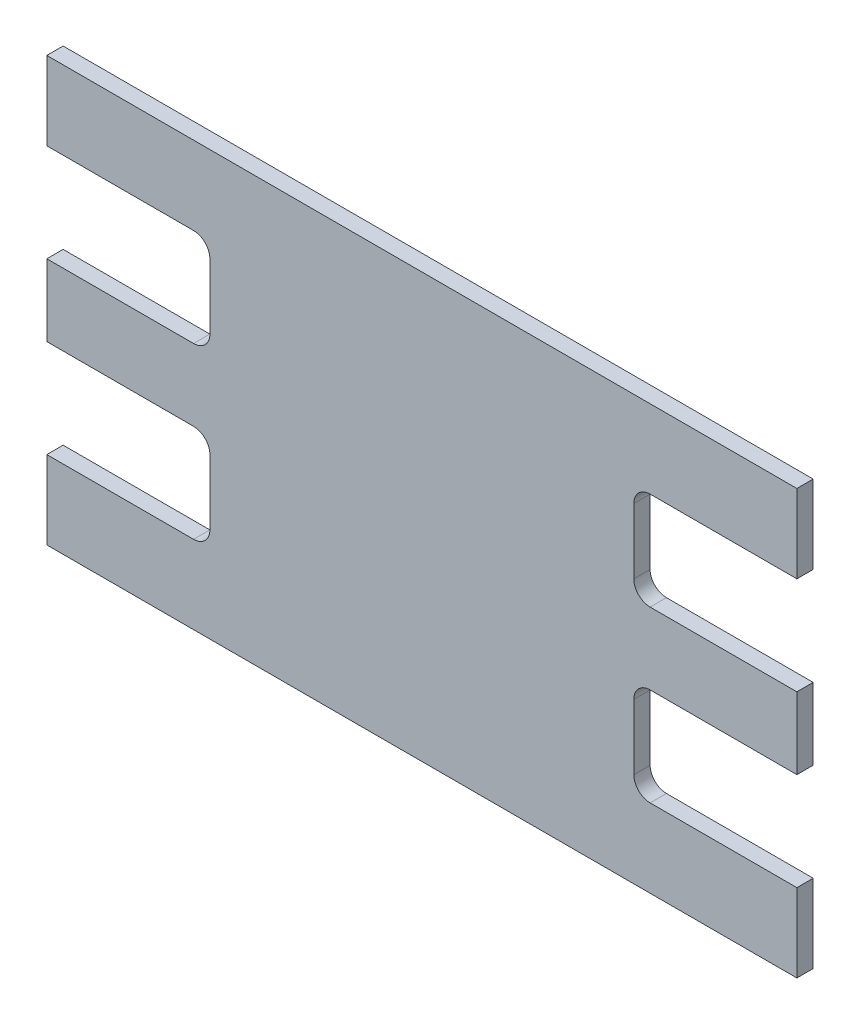
ISO-10303-21;
HEADER;
FILE_DESCRIPTION(('STEP AP214'),'2;1');
FILE_NAME('part.step','',(''),(''),'','','');
FILE_SCHEMA(('AUTOMOTIVE_DESIGN { 1 0 10303 214 1 1 1 1 }'));
ENDSEC;
DATA;
#1=APPLICATION_CONTEXT('core data for automotive mechanical design processes');
#2=APPLICATION_PROTOCOL_DEFINITION('international standard','automotive_design',2000,#1);
#3=PRODUCT_CONTEXT('',#1,'mechanical');
#4=PRODUCT('Part','Part','',(#3));
#5=PRODUCT_RELATED_PRODUCT_CATEGORY('part','',(#4));
#6=PRODUCT_DEFINITION_FORMATION('','',#4);
#7=PRODUCT_DEFINITION_CONTEXT('part definition',#1,'design');
#8=PRODUCT_DEFINITION('design','',#6,#7);
#9=PRODUCT_DEFINITION_SHAPE('','',#8);
#10=(LENGTH_UNIT() NAMED_UNIT(*) SI_UNIT(.MILLI.,.METRE.));
#11=(NAMED_UNIT(*) PLANE_ANGLE_UNIT() SI_UNIT($,.RADIAN.));
#12=(NAMED_UNIT(*) SI_UNIT($,.STERADIAN.) SOLID_ANGLE_UNIT());
#13=UNCERTAINTY_MEASURE_WITH_UNIT(LENGTH_MEASURE(1.E-05),#10,'distance_accuracy_value','');
#14=(GEOMETRIC_REPRESENTATION_CONTEXT(3) GLOBAL_UNCERTAINTY_ASSIGNED_CONTEXT((#13)) GLOBAL_UNIT_ASSIGNED_CONTEXT((#10,
#11,#12)) REPRESENTATION_CONTEXT('',''));
#15=CARTESIAN_POINT('',(0.,0.,0.));
#16=DIRECTION('',(0.,0.,1.));
#17=DIRECTION('',(1.,0.,0.));
#18=AXIS2_PLACEMENT_3D('',#15,#16,#17);
#19=CARTESIAN_POINT('',(146.05,82.55,6.35));
#20=DIRECTION('',(-1.,0.,0.));
#21=DIRECTION('',(0.,-1.,0.));
#22=AXIS2_PLACEMENT_3D('',#19,#20,#21);
#23=PLANE('',#22);
#24=DIRECTION('',(0.,1.,0.));
#25=VECTOR('',#24,1.);
#26=CARTESIAN_POINT('',(146.05,82.55,6.35));
#27=LINE('',#26,#25);
#28=CARTESIAN_POINT('',(146.05,52.0700000000001,6.35));
#29=VERTEX_POINT('',#28);
#30=CARTESIAN_POINT('',(146.05,82.55,6.35));
#31=VERTEX_POINT('',#30);
#32=EDGE_CURVE('E397',#29,#31,#27,.T.);
#33=ORIENTED_EDGE('',*,*,#32,.F.);
#34=DIRECTION('',(0.,0.,1.));
#35=VECTOR('',#34,1.);
#36=CARTESIAN_POINT('',(146.05,52.0700000000001,0.));
#37=LINE('',#36,#35);
#38=CARTESIAN_POINT('',(146.05,52.0700000000001,0.));
#39=VERTEX_POINT('',#38);
#40=EDGE_CURVE('E260',#39,#29,#37,.T.);
#41=ORIENTED_EDGE('',*,*,#40,.F.);
#42=DIRECTION('',(0.,1.,0.));
#43=VECTOR('',#42,1.);
#44=CARTESIAN_POINT('',(146.05,82.55,0.));
#45=LINE('',#44,#43);
#46=CARTESIAN_POINT('',(146.05,82.55,0.));
#47=VERTEX_POINT('',#46);
#48=EDGE_CURVE('E382',#39,#47,#45,.T.);
#49=ORIENTED_EDGE('',*,*,#48,.T.);
#50=DIRECTION('',(0.,0.,-1.));
#51=VECTOR('',#50,1.);
#52=CARTESIAN_POINT('',(146.05,82.55,6.35));
#53=LINE('',#52,#51);
#54=EDGE_CURVE('E11',#31,#47,#53,.T.);
#55=ORIENTED_EDGE('',*,*,#54,.F.);
#56=EDGE_LOOP('',(#33,#41,#49,#55));
#57=FACE_BOUND('',#56,.T.);
#58=ADVANCED_FACE('F33',(#57),#23,.F.);
#59=CARTESIAN_POINT('',(146.05,-13.9700000000001,0.));
#60=VERTEX_POINT('',#59);
#61=CARTESIAN_POINT('',(146.05,13.9700000000001,0.));
#62=VERTEX_POINT('',#61);
#63=EDGE_CURVE('E411',#60,#62,#45,.T.);
#64=ORIENTED_EDGE('',*,*,#63,.T.);
#65=DIRECTION('',(0.,0.,1.));
#66=VECTOR('',#65,1.);
#67=CARTESIAN_POINT('',(146.05,13.9700000000001,0.));
#68=LINE('',#67,#66);
#69=CARTESIAN_POINT('',(146.05,13.9700000000001,6.35));
#70=VERTEX_POINT('',#69);
#71=EDGE_CURVE('E262',#62,#70,#68,.T.);
#72=ORIENTED_EDGE('',*,*,#71,.T.);
#73=CARTESIAN_POINT('',(146.05,-13.9700000000001,6.35));
#74=VERTEX_POINT('',#73);
#75=EDGE_CURVE('E396',#74,#70,#27,.T.);
#76=ORIENTED_EDGE('',*,*,#75,.F.);
#77=DIRECTION('',(0.,0.,1.));
#78=VECTOR('',#77,1.);
#79=CARTESIAN_POINT('',(146.05,-13.9700000000001,0.));
#80=LINE('',#79,#78);
#81=EDGE_CURVE('E298',#60,#74,#80,.T.);
#82=ORIENTED_EDGE('',*,*,#81,.F.);
#83=EDGE_LOOP('',(#64,#72,#76,#82));
#84=FACE_BOUND('',#83,.T.);
#85=ADVANCED_FACE('F451',(#84),#23,.F.);
#86=CARTESIAN_POINT('',(-146.05,82.55,6.35));
#87=DIRECTION('',(1.,0.,0.));
#88=DIRECTION('',(0.,1.,0.));
#89=AXIS2_PLACEMENT_3D('',#86,#87,#88);
#90=PLANE('',#89);
#91=DIRECTION('',(0.,-1.,0.));
#92=VECTOR('',#91,1.);
#93=CARTESIAN_POINT('',(-146.05,82.55,6.35));
#94=LINE('',#93,#92);
#95=CARTESIAN_POINT('',(-146.05,-52.07,6.35));
#96=VERTEX_POINT('',#95);
#97=CARTESIAN_POINT('',(-146.05,-82.55,6.35));
#98=VERTEX_POINT('',#97);
#99=EDGE_CURVE('E399',#96,#98,#94,.T.);
#100=ORIENTED_EDGE('',*,*,#99,.F.);
#101=DIRECTION('',(0.,0.,1.));
#102=VECTOR('',#101,1.);
#103=CARTESIAN_POINT('',(-146.05,-52.07,0.));
#104=LINE('',#103,#102);
#105=CARTESIAN_POINT('',(-146.05,-52.07,0.));
#106=VERTEX_POINT('',#105);
#107=EDGE_CURVE('E340',#106,#96,#104,.T.);
#108=ORIENTED_EDGE('',*,*,#107,.F.);
#109=DIRECTION('',(0.,-1.,0.));
#110=VECTOR('',#109,1.);
#111=CARTESIAN_POINT('',(-146.05,82.55,0.));
#112=LINE('',#111,#110);
#113=CARTESIAN_POINT('',(-146.05,-82.55,0.));
#114=VERTEX_POINT('',#113);
#115=EDGE_CURVE('E413',#106,#114,#112,.T.);
#116=ORIENTED_EDGE('',*,*,#115,.T.);
#117=DIRECTION('',(0.,0.,-1.));
#118=VECTOR('',#117,1.);
#119=CARTESIAN_POINT('',(-146.05,-82.55,6.35));
#120=LINE('',#119,#118);
#121=EDGE_CURVE('E422',#98,#114,#120,.T.);
#122=ORIENTED_EDGE('',*,*,#121,.F.);
#123=EDGE_LOOP('',(#100,#108,#116,#122));
#124=FACE_BOUND('',#123,.T.);
#125=ADVANCED_FACE('F488',(#124),#90,.F.);
#126=CARTESIAN_POINT('',(-146.05,82.55,0.));
#127=VERTEX_POINT('',#126);
#128=CARTESIAN_POINT('',(-146.05,52.07,0.));
#129=VERTEX_POINT('',#128);
#130=EDGE_CURVE('E414',#127,#129,#112,.T.);
#131=ORIENTED_EDGE('',*,*,#130,.T.);
#132=DIRECTION('',(0.,0.,1.));
#133=VECTOR('',#132,1.);
#134=CARTESIAN_POINT('',(-146.05,52.07,0.));
#135=LINE('',#134,#133);
#136=CARTESIAN_POINT('',(-146.05,52.07,6.35));
#137=VERTEX_POINT('',#136);
#138=EDGE_CURVE('E379',#129,#137,#135,.T.);
#139=ORIENTED_EDGE('',*,*,#138,.T.);
#140=CARTESIAN_POINT('',(-146.05,82.55,6.35));
#141=VERTEX_POINT('',#140);
#142=EDGE_CURVE('E400',#141,#137,#94,.T.);
#143=ORIENTED_EDGE('',*,*,#142,.F.);
#144=DIRECTION('',(0.,0.,-1.));
#145=VECTOR('',#144,1.);
#146=CARTESIAN_POINT('',(-146.05,82.55,6.35));
#147=LINE('',#146,#145);
#148=EDGE_CURVE('E41',#141,#127,#147,.T.);
#149=ORIENTED_EDGE('',*,*,#148,.T.);
#150=EDGE_LOOP('',(#131,#139,#143,#149));
#151=FACE_BOUND('',#150,.T.);
#152=ADVANCED_FACE('F429',(#151),#90,.F.);
#153=CARTESIAN_POINT('',(146.05,-82.55,0.));
#154=VERTEX_POINT('',#153);
#155=CARTESIAN_POINT('',(146.05,-52.0700000000001,0.));
#156=VERTEX_POINT('',#155);
#157=EDGE_CURVE('E407',#154,#156,#45,.T.);
#158=ORIENTED_EDGE('',*,*,#157,.T.);
#159=DIRECTION('',(0.,0.,1.));
#160=VECTOR('',#159,1.);
#161=CARTESIAN_POINT('',(146.05,-52.0700000000001,0.));
#162=LINE('',#161,#160);
#163=CARTESIAN_POINT('',(146.05,-52.0700000000001,6.35));
#164=VERTEX_POINT('',#163);
#165=EDGE_CURVE('E300',#156,#164,#162,.T.);
#166=ORIENTED_EDGE('',*,*,#165,.T.);
#167=CARTESIAN_POINT('',(146.05,-82.55,6.35));
#168=VERTEX_POINT('',#167);
#169=EDGE_CURVE('E392',#168,#164,#27,.T.);
#170=ORIENTED_EDGE('',*,*,#169,.F.);
#171=DIRECTION('',(0.,0.,-1.));
#172=VECTOR('',#171,1.);
#173=CARTESIAN_POINT('',(146.05,-82.55,6.35));
#174=LINE('',#173,#172);
#175=EDGE_CURVE('E406',#168,#154,#174,.T.);
#176=ORIENTED_EDGE('',*,*,#175,.T.);
#177=EDGE_LOOP('',(#158,#166,#170,#176));
#178=FACE_BOUND('',#177,.T.);
#179=ADVANCED_FACE('F35',(#178),#23,.F.);
#180=CARTESIAN_POINT('',(-146.05,82.55,6.35));
#181=DIRECTION('',(0.,-1.,0.));
#182=DIRECTION('',(0.,0.,-1.));
#183=AXIS2_PLACEMENT_3D('',#180,#181,#182);
#184=PLANE('',#183);
#185=DIRECTION('',(-1.,0.,0.));
#186=VECTOR('',#185,1.);
#187=CARTESIAN_POINT('',(-146.05,82.55,0.));
#188=LINE('',#187,#186);
#189=EDGE_CURVE('E410',#47,#127,#188,.T.);
#190=ORIENTED_EDGE('',*,*,#189,.T.);
#191=ORIENTED_EDGE('',*,*,#148,.F.);
#192=DIRECTION('',(-1.,0.,0.));
#193=VECTOR('',#192,1.);
#194=CARTESIAN_POINT('',(-146.05,82.55,6.35));
#195=LINE('',#194,#193);
#196=EDGE_CURVE('E395',#31,#141,#195,.T.);
#197=ORIENTED_EDGE('',*,*,#196,.F.);
#198=ORIENTED_EDGE('',*,*,#54,.T.);
#199=EDGE_LOOP('',(#190,#191,#197,#198));
#200=FACE_BOUND('',#199,.T.);
#201=ADVANCED_FACE('F444',(#200),#184,.F.);
#202=CARTESIAN_POINT('',(-146.05,13.97,0.));
#203=VERTEX_POINT('',#202);
#204=CARTESIAN_POINT('',(-146.05,-13.97,0.));
#205=VERTEX_POINT('',#204);
#206=EDGE_CURVE('E418',#203,#205,#112,.T.);
#207=ORIENTED_EDGE('',*,*,#206,.T.);
#208=DIRECTION('',(0.,0.,1.));
#209=VECTOR('',#208,1.);
#210=CARTESIAN_POINT('',(-146.05,-13.97,0.));
#211=LINE('',#210,#209);
#212=CARTESIAN_POINT('',(-146.05,-13.97,6.35));
#213=VERTEX_POINT('',#212);
#214=EDGE_CURVE('E342',#205,#213,#211,.T.);
#215=ORIENTED_EDGE('',*,*,#214,.T.);
#216=CARTESIAN_POINT('',(-146.05,13.97,6.35));
#217=VERTEX_POINT('',#216);
#218=EDGE_CURVE('E404',#217,#213,#94,.T.);
#219=ORIENTED_EDGE('',*,*,#218,.F.);
#220=DIRECTION('',(0.,0.,1.));
#221=VECTOR('',#220,1.);
#222=CARTESIAN_POINT('',(-146.05,13.97,0.));
#223=LINE('',#222,#221);
#224=EDGE_CURVE('E366',#203,#217,#223,.T.);
#225=ORIENTED_EDGE('',*,*,#224,.F.);
#226=EDGE_LOOP('',(#207,#215,#219,#225));
#227=FACE_BOUND('',#226,.T.);
#228=ADVANCED_FACE('F494',(#227),#90,.F.);
#229=CARTESIAN_POINT('',(-146.05,-82.55,6.35));
#230=DIRECTION('',(0.,1.,0.));
#231=DIRECTION('',(0.,0.,1.));
#232=AXIS2_PLACEMENT_3D('',#229,#230,#231);
#233=PLANE('',#232);
#234=DIRECTION('',(1.,0.,0.));
#235=VECTOR('',#234,1.);
#236=CARTESIAN_POINT('',(-146.05,-82.55,0.));
#237=LINE('',#236,#235);
#238=EDGE_CURVE('E417',#114,#154,#237,.T.);
#239=ORIENTED_EDGE('',*,*,#238,.T.);
#240=ORIENTED_EDGE('',*,*,#175,.F.);
#241=DIRECTION('',(1.,0.,0.));
#242=VECTOR('',#241,1.);
#243=CARTESIAN_POINT('',(-146.05,-82.55,6.35));
#244=LINE('',#243,#242);
#245=EDGE_CURVE('E403',#98,#168,#244,.T.);
#246=ORIENTED_EDGE('',*,*,#245,.F.);
#247=ORIENTED_EDGE('',*,*,#121,.T.);
#248=EDGE_LOOP('',(#239,#240,#246,#247));
#249=FACE_BOUND('',#248,.T.);
#250=ADVANCED_FACE('F483',(#249),#233,.F.);
#251=CARTESIAN_POINT('',(146.05,-82.55,6.35));
#252=DIRECTION('',(0.,0.,1.));
#253=DIRECTION('',(1.,0.,0.));
#254=AXIS2_PLACEMENT_3D('',#251,#252,#253);
#255=PLANE('',#254);
#256=DIRECTION('',(-1.,0.,0.));
#257=VECTOR('',#256,1.);
#258=CARTESIAN_POINT('',(146.05,52.0700000000001,6.35));
#259=LINE('',#258,#257);
#260=CARTESIAN_POINT('',(88.9,52.07,6.35));
#261=VERTEX_POINT('',#260);
#262=EDGE_CURVE('E239',#29,#261,#259,.T.);
#263=ORIENTED_EDGE('',*,*,#262,.F.);
#264=ORIENTED_EDGE('',*,*,#32,.T.);
#265=ORIENTED_EDGE('',*,*,#196,.T.);
#266=ORIENTED_EDGE('',*,*,#142,.T.);
#267=DIRECTION('',(-1.,0.,0.));
#268=VECTOR('',#267,1.);
#269=CARTESIAN_POINT('',(-146.05,52.07,6.35));
#270=LINE('',#269,#268);
#271=CARTESIAN_POINT('',(-88.9,52.07,6.35));
#272=VERTEX_POINT('',#271);
#273=EDGE_CURVE('E354',#272,#137,#270,.T.);
#274=ORIENTED_EDGE('',*,*,#273,.F.);
#275=CARTESIAN_POINT('',(-88.9,45.72,6.35));
#276=DIRECTION('',(0.,0.,1.));
#277=DIRECTION('',(1.,0.,0.));
#278=AXIS2_PLACEMENT_3D('',#275,#276,#277);
#279=CIRCLE('',#278,6.35);
#280=CARTESIAN_POINT('',(-82.55,45.72,6.35));
#281=VERTEX_POINT('',#280);
#282=EDGE_CURVE('E375',#281,#272,#279,.T.);
#283=ORIENTED_EDGE('',*,*,#282,.F.);
#284=DIRECTION('',(0.,1.,0.));
#285=VECTOR('',#284,1.);
#286=CARTESIAN_POINT('',(-82.55,45.72,6.35));
#287=LINE('',#286,#285);
#288=CARTESIAN_POINT('',(-82.55,20.32,6.35));
#289=VERTEX_POINT('',#288);
#290=EDGE_CURVE('E372',#289,#281,#287,.T.);
#291=ORIENTED_EDGE('',*,*,#290,.F.);
#292=CARTESIAN_POINT('',(-88.9,20.32,6.35));
#293=DIRECTION('',(0.,0.,1.));
#294=DIRECTION('',(1.,0.,0.));
#295=AXIS2_PLACEMENT_3D('',#292,#293,#294);
#296=CIRCLE('',#295,6.35);
#297=CARTESIAN_POINT('',(-88.9,13.97,6.35));
#298=VERTEX_POINT('',#297);
#299=EDGE_CURVE('E369',#298,#289,#296,.T.);
#300=ORIENTED_EDGE('',*,*,#299,.F.);
#301=DIRECTION('',(1.,0.,0.));
#302=VECTOR('',#301,1.);
#303=CARTESIAN_POINT('',(-88.9,13.97,6.35));
#304=LINE('',#303,#302);
#305=EDGE_CURVE('E339',#217,#298,#304,.T.);
#306=ORIENTED_EDGE('',*,*,#305,.F.);
#307=ORIENTED_EDGE('',*,*,#218,.T.);
#308=DIRECTION('',(-1.,0.,0.));
#309=VECTOR('',#308,1.);
#310=CARTESIAN_POINT('',(-88.9,-13.97,6.35));
#311=LINE('',#310,#309);
#312=CARTESIAN_POINT('',(-88.9,-13.97,6.35));
#313=VERTEX_POINT('',#312);
#314=EDGE_CURVE('E333',#313,#213,#311,.T.);
#315=ORIENTED_EDGE('',*,*,#314,.F.);
#316=CARTESIAN_POINT('',(-88.9,-20.32,6.35));
#317=DIRECTION('',(0.,0.,1.));
#318=DIRECTION('',(-1.,0.,0.));
#319=AXIS2_PLACEMENT_3D('',#316,#317,#318);
#320=CIRCLE('',#319,6.35);
#321=CARTESIAN_POINT('',(-82.55,-20.32,6.35));
#322=VERTEX_POINT('',#321);
#323=EDGE_CURVE('E330',#322,#313,#320,.T.);
#324=ORIENTED_EDGE('',*,*,#323,.F.);
#325=DIRECTION('',(0.,1.,0.));
#326=VECTOR('',#325,1.);
#327=CARTESIAN_POINT('',(-82.55,-45.72,6.35));
#328=LINE('',#327,#326);
#329=CARTESIAN_POINT('',(-82.55,-45.72,6.35));
#330=VERTEX_POINT('',#329);
#331=EDGE_CURVE('E327',#330,#322,#328,.T.);
#332=ORIENTED_EDGE('',*,*,#331,.F.);
#333=CARTESIAN_POINT('',(-88.9,-45.72,6.35));
#334=DIRECTION('',(0.,0.,1.));
#335=DIRECTION('',(-1.,0.,0.));
#336=AXIS2_PLACEMENT_3D('',#333,#334,#335);
#337=CIRCLE('',#336,6.35);
#338=CARTESIAN_POINT('',(-88.9,-52.07,6.35));
#339=VERTEX_POINT('',#338);
#340=EDGE_CURVE('E297',#339,#330,#337,.T.);
#341=ORIENTED_EDGE('',*,*,#340,.F.);
#342=DIRECTION('',(1.,0.,0.));
#343=VECTOR('',#342,1.);
#344=CARTESIAN_POINT('',(-146.05,-52.07,6.35));
#345=LINE('',#344,#343);
#346=EDGE_CURVE('E312',#96,#339,#345,.T.);
#347=ORIENTED_EDGE('',*,*,#346,.F.);
#348=ORIENTED_EDGE('',*,*,#99,.T.);
#349=ORIENTED_EDGE('',*,*,#245,.T.);
#350=ORIENTED_EDGE('',*,*,#169,.T.);
#351=DIRECTION('',(1.,0.,0.));
#352=VECTOR('',#351,1.);
#353=CARTESIAN_POINT('',(146.05,-52.0700000000001,6.35));
#354=LINE('',#353,#352);
#355=CARTESIAN_POINT('',(88.9,-52.07,6.35));
#356=VERTEX_POINT('',#355);
#357=EDGE_CURVE('E291',#356,#164,#354,.T.);
#358=ORIENTED_EDGE('',*,*,#357,.F.);
#359=CARTESIAN_POINT('',(88.9,-45.72,6.35));
#360=DIRECTION('',(0.,0.,1.));
#361=DIRECTION('',(1.,0.,0.));
#362=AXIS2_PLACEMENT_3D('',#359,#360,#361);
#363=CIRCLE('',#362,6.35);
#364=CARTESIAN_POINT('',(82.55,-45.72,6.35));
#365=VERTEX_POINT('',#364);
#366=EDGE_CURVE('E288',#365,#356,#363,.T.);
#367=ORIENTED_EDGE('',*,*,#366,.F.);
#368=DIRECTION('',(0.,-1.,0.));
#369=VECTOR('',#368,1.);
#370=CARTESIAN_POINT('',(82.55,-45.72,6.35));
#371=LINE('',#370,#369);
#372=CARTESIAN_POINT('',(82.55,-20.32,6.35));
#373=VERTEX_POINT('',#372);
#374=EDGE_CURVE('E285',#373,#365,#371,.T.);
#375=ORIENTED_EDGE('',*,*,#374,.F.);
#376=CARTESIAN_POINT('',(88.9,-20.32,6.35));
#377=DIRECTION('',(0.,0.,1.));
#378=DIRECTION('',(1.,0.,0.));
#379=AXIS2_PLACEMENT_3D('',#376,#377,#378);
#380=CIRCLE('',#379,6.35);
#381=CARTESIAN_POINT('',(88.9,-13.97,6.35));
#382=VERTEX_POINT('',#381);
#383=EDGE_CURVE('E259',#382,#373,#380,.T.);
#384=ORIENTED_EDGE('',*,*,#383,.F.);
#385=DIRECTION('',(-1.,0.,0.));
#386=VECTOR('',#385,1.);
#387=CARTESIAN_POINT('',(88.9,-13.97,6.35));
#388=LINE('',#387,#386);
#389=EDGE_CURVE('E272',#74,#382,#388,.T.);
#390=ORIENTED_EDGE('',*,*,#389,.F.);
#391=ORIENTED_EDGE('',*,*,#75,.T.);
#392=DIRECTION('',(1.,0.,0.));
#393=VECTOR('',#392,1.);
#394=CARTESIAN_POINT('',(88.9,13.97,6.35));
#395=LINE('',#394,#393);
#396=CARTESIAN_POINT('',(88.9,13.97,6.35));
#397=VERTEX_POINT('',#396);
#398=EDGE_CURVE('E242',#397,#70,#395,.T.);
#399=ORIENTED_EDGE('',*,*,#398,.F.);
#400=CARTESIAN_POINT('',(88.9,20.32,6.35));
#401=DIRECTION('',(0.,0.,1.));
#402=DIRECTION('',(-1.,0.,0.));
#403=AXIS2_PLACEMENT_3D('',#400,#401,#402);
#404=CIRCLE('',#403,6.35);
#405=CARTESIAN_POINT('',(82.55,20.32,6.35));
#406=VERTEX_POINT('',#405);
#407=EDGE_CURVE('E253',#406,#397,#404,.T.);
#408=ORIENTED_EDGE('',*,*,#407,.F.);
#409=DIRECTION('',(0.,-1.,0.));
#410=VECTOR('',#409,1.);
#411=CARTESIAN_POINT('',(82.55,45.72,6.35));
#412=LINE('',#411,#410);
#413=CARTESIAN_POINT('',(82.55,45.72,6.35));
#414=VERTEX_POINT('',#413);
#415=EDGE_CURVE('E251',#414,#406,#412,.T.);
#416=ORIENTED_EDGE('',*,*,#415,.F.);
#417=CARTESIAN_POINT('',(88.9,45.72,6.35));
#418=DIRECTION('',(0.,0.,1.));
#419=DIRECTION('',(-1.,0.,0.));
#420=AXIS2_PLACEMENT_3D('',#417,#418,#419);
#421=CIRCLE('',#420,6.35);
#422=EDGE_CURVE('E225',#261,#414,#421,.T.);
#423=ORIENTED_EDGE('',*,*,#422,.F.);
#424=EDGE_LOOP('',(#263,#264,#265,#266,#274,#283,#291,#300,#306,#307,#315,#324,#332,#341,#347,
#348,#349,#350,#358,#367,#375,#384,#390,#391,#399,#408,#416,#423));
#425=FACE_BOUND('',#424,.T.);
#426=ADVANCED_FACE('F440',(#425),#255,.T.);
#427=CARTESIAN_POINT('',(146.05,-82.55,0.));
#428=DIRECTION('',(0.,0.,1.));
#429=DIRECTION('',(1.,0.,0.));
#430=AXIS2_PLACEMENT_3D('',#427,#428,#429);
#431=PLANE('',#430);
#432=ORIENTED_EDGE('',*,*,#48,.F.);
#433=DIRECTION('',(-1.,0.,0.));
#434=VECTOR('',#433,1.);
#435=CARTESIAN_POINT('',(146.05,52.0700000000001,0.));
#436=LINE('',#435,#434);
#437=CARTESIAN_POINT('',(88.9,52.07,0.));
#438=VERTEX_POINT('',#437);
#439=EDGE_CURVE('E230',#39,#438,#436,.T.);
#440=ORIENTED_EDGE('',*,*,#439,.T.);
#441=CARTESIAN_POINT('',(88.9,45.72,0.));
#442=DIRECTION('',(0.,0.,1.));
#443=DIRECTION('',(-1.,0.,0.));
#444=AXIS2_PLACEMENT_3D('',#441,#442,#443);
#445=CIRCLE('',#444,6.35);
#446=CARTESIAN_POINT('',(82.55,45.72,0.));
#447=VERTEX_POINT('',#446);
#448=EDGE_CURVE('E222',#438,#447,#445,.T.);
#449=ORIENTED_EDGE('',*,*,#448,.T.);
#450=DIRECTION('',(0.,-1.,0.));
#451=VECTOR('',#450,1.);
#452=CARTESIAN_POINT('',(82.55,45.72,0.));
#453=LINE('',#452,#451);
#454=CARTESIAN_POINT('',(82.55,20.32,0.));
#455=VERTEX_POINT('',#454);
#456=EDGE_CURVE('E233',#447,#455,#453,.T.);
#457=ORIENTED_EDGE('',*,*,#456,.T.);
#458=CARTESIAN_POINT('',(88.9,20.32,0.));
#459=DIRECTION('',(0.,0.,1.));
#460=DIRECTION('',(-1.,0.,0.));
#461=AXIS2_PLACEMENT_3D('',#458,#459,#460);
#462=CIRCLE('',#461,6.35);
#463=CARTESIAN_POINT('',(88.9,13.97,0.));
#464=VERTEX_POINT('',#463);
#465=EDGE_CURVE('E48',#455,#464,#462,.T.);
#466=ORIENTED_EDGE('',*,*,#465,.T.);
#467=DIRECTION('',(1.,0.,0.));
#468=VECTOR('',#467,1.);
#469=CARTESIAN_POINT('',(88.9,13.97,0.));
#470=LINE('',#469,#468);
#471=EDGE_CURVE('E246',#464,#62,#470,.T.);
#472=ORIENTED_EDGE('',*,*,#471,.T.);
#473=ORIENTED_EDGE('',*,*,#63,.F.);
#474=DIRECTION('',(-1.,0.,0.));
#475=VECTOR('',#474,1.);
#476=CARTESIAN_POINT('',(88.9,-13.97,0.));
#477=LINE('',#476,#475);
#478=CARTESIAN_POINT('',(88.9,-13.97,0.));
#479=VERTEX_POINT('',#478);
#480=EDGE_CURVE('E279',#60,#479,#477,.T.);
#481=ORIENTED_EDGE('',*,*,#480,.T.);
#482=CARTESIAN_POINT('',(88.9,-20.32,0.));
#483=DIRECTION('',(0.,0.,1.));
#484=DIRECTION('',(1.,0.,0.));
#485=AXIS2_PLACEMENT_3D('',#482,#483,#484);
#486=CIRCLE('',#485,6.35);
#487=CARTESIAN_POINT('',(82.55,-20.32,0.));
#488=VERTEX_POINT('',#487);
#489=EDGE_CURVE('E268',#479,#488,#486,.T.);
#490=ORIENTED_EDGE('',*,*,#489,.T.);
#491=DIRECTION('',(0.,-1.,0.));
#492=VECTOR('',#491,1.);
#493=CARTESIAN_POINT('',(82.55,-45.72,0.));
#494=LINE('',#493,#492);
#495=CARTESIAN_POINT('',(82.55,-45.72,0.));
#496=VERTEX_POINT('',#495);
#497=EDGE_CURVE('E271',#488,#496,#494,.T.);
#498=ORIENTED_EDGE('',*,*,#497,.T.);
#499=CARTESIAN_POINT('',(88.9,-45.72,0.));
#500=DIRECTION('',(0.,0.,1.));
#501=DIRECTION('',(1.,0.,0.));
#502=AXIS2_PLACEMENT_3D('',#499,#500,#501);
#503=CIRCLE('',#502,6.35);
#504=CARTESIAN_POINT('',(88.9,-52.07,0.));
#505=VERTEX_POINT('',#504);
#506=EDGE_CURVE('E56',#496,#505,#503,.T.);
#507=ORIENTED_EDGE('',*,*,#506,.T.);
#508=DIRECTION('',(1.,0.,0.));
#509=VECTOR('',#508,1.);
#510=CARTESIAN_POINT('',(146.05,-52.0700000000001,0.));
#511=LINE('',#510,#509);
#512=EDGE_CURVE('E276',#505,#156,#511,.T.);
#513=ORIENTED_EDGE('',*,*,#512,.T.);
#514=ORIENTED_EDGE('',*,*,#157,.F.);
#515=ORIENTED_EDGE('',*,*,#238,.F.);
#516=ORIENTED_EDGE('',*,*,#115,.F.);
#517=DIRECTION('',(1.,0.,0.));
#518=VECTOR('',#517,1.);
#519=CARTESIAN_POINT('',(-146.05,-52.07,0.));
#520=LINE('',#519,#518);
#521=CARTESIAN_POINT('',(-88.9,-52.07,0.));
#522=VERTEX_POINT('',#521);
#523=EDGE_CURVE('E321',#106,#522,#520,.T.);
#524=ORIENTED_EDGE('',*,*,#523,.T.);
#525=CARTESIAN_POINT('',(-88.9,-45.72,0.));
#526=DIRECTION('',(0.,0.,1.));
#527=DIRECTION('',(-1.,0.,0.));
#528=AXIS2_PLACEMENT_3D('',#525,#526,#527);
#529=CIRCLE('',#528,6.35);
#530=CARTESIAN_POINT('',(-82.55,-45.72,0.));
#531=VERTEX_POINT('',#530);
#532=EDGE_CURVE('E308',#522,#531,#529,.T.);
#533=ORIENTED_EDGE('',*,*,#532,.T.);
#534=DIRECTION('',(0.,1.,0.));
#535=VECTOR('',#534,1.);
#536=CARTESIAN_POINT('',(-82.55,-45.72,0.));
#537=LINE('',#536,#535);
#538=CARTESIAN_POINT('',(-82.55,-20.32,0.));
#539=VERTEX_POINT('',#538);
#540=EDGE_CURVE('E311',#531,#539,#537,.T.);
#541=ORIENTED_EDGE('',*,*,#540,.T.);
#542=CARTESIAN_POINT('',(-88.9,-20.32,0.));
#543=DIRECTION('',(0.,0.,1.));
#544=DIRECTION('',(-1.,0.,0.));
#545=AXIS2_PLACEMENT_3D('',#542,#543,#544);
#546=CIRCLE('',#545,6.35);
#547=CARTESIAN_POINT('',(-88.9,-13.97,0.));
#548=VERTEX_POINT('',#547);
#549=EDGE_CURVE('E315',#539,#548,#546,.T.);
#550=ORIENTED_EDGE('',*,*,#549,.T.);
#551=DIRECTION('',(-1.,0.,0.));
#552=VECTOR('',#551,1.);
#553=CARTESIAN_POINT('',(-88.9,-13.97,0.));
#554=LINE('',#553,#552);
#555=EDGE_CURVE('E318',#548,#205,#554,.T.);
#556=ORIENTED_EDGE('',*,*,#555,.T.);
#557=ORIENTED_EDGE('',*,*,#206,.F.);
#558=DIRECTION('',(1.,0.,0.));
#559=VECTOR('',#558,1.);
#560=CARTESIAN_POINT('',(-88.9,13.97,0.));
#561=LINE('',#560,#559);
#562=CARTESIAN_POINT('',(-88.9,13.97,0.));
#563=VERTEX_POINT('',#562);
#564=EDGE_CURVE('E350',#203,#563,#561,.T.);
#565=ORIENTED_EDGE('',*,*,#564,.T.);
#566=CARTESIAN_POINT('',(-88.9,20.32,0.));
#567=DIRECTION('',(0.,0.,1.));
#568=DIRECTION('',(1.,0.,0.));
#569=AXIS2_PLACEMENT_3D('',#566,#567,#568);
#570=CIRCLE('',#569,6.35);
#571=CARTESIAN_POINT('',(-82.55,20.32,0.));
#572=VERTEX_POINT('',#571);
#573=EDGE_CURVE('E353',#563,#572,#570,.T.);
#574=ORIENTED_EDGE('',*,*,#573,.T.);
#575=DIRECTION('',(0.,1.,0.));
#576=VECTOR('',#575,1.);
#577=CARTESIAN_POINT('',(-82.55,45.72,0.));
#578=LINE('',#577,#576);
#579=CARTESIAN_POINT('',(-82.55,45.72,0.));
#580=VERTEX_POINT('',#579);
#581=EDGE_CURVE('E357',#572,#580,#578,.T.);
#582=ORIENTED_EDGE('',*,*,#581,.T.);
#583=CARTESIAN_POINT('',(-88.9,45.72,0.));
#584=DIRECTION('',(0.,0.,1.));
#585=DIRECTION('',(1.,0.,0.));
#586=AXIS2_PLACEMENT_3D('',#583,#584,#585);
#587=CIRCLE('',#586,6.35);
#588=CARTESIAN_POINT('',(-88.9,52.07,0.));
#589=VERTEX_POINT('',#588);
#590=EDGE_CURVE('E360',#580,#589,#587,.T.);
#591=ORIENTED_EDGE('',*,*,#590,.T.);
#592=DIRECTION('',(-1.,0.,0.));
#593=VECTOR('',#592,1.);
#594=CARTESIAN_POINT('',(-146.05,52.07,0.));
#595=LINE('',#594,#593);
#596=EDGE_CURVE('E363',#589,#129,#595,.T.);
#597=ORIENTED_EDGE('',*,*,#596,.T.);
#598=ORIENTED_EDGE('',*,*,#130,.F.);
#599=ORIENTED_EDGE('',*,*,#189,.F.);
#600=EDGE_LOOP('',(#432,#440,#449,#457,#466,#472,#473,#481,#490,#498,#507,#513,#514,#515,#516,
#524,#533,#541,#550,#556,#557,#565,#574,#582,#591,#597,#598,#599));
#601=FACE_BOUND('',#600,.T.);
#602=ADVANCED_FACE('F238',(#601),#431,.F.);
#603=CARTESIAN_POINT('',(-146.05,52.07,0.));
#604=DIRECTION('',(0.,1.,0.));
#605=DIRECTION('',(0.,0.,1.));
#606=AXIS2_PLACEMENT_3D('',#603,#604,#605);
#607=PLANE('',#606);
#608=ORIENTED_EDGE('',*,*,#273,.T.);
#609=ORIENTED_EDGE('',*,*,#138,.F.);
#610=ORIENTED_EDGE('',*,*,#596,.F.);
#611=DIRECTION('',(0.,0.,1.));
#612=VECTOR('',#611,1.);
#613=CARTESIAN_POINT('',(-88.9,52.07,0.));
#614=LINE('',#613,#612);
#615=EDGE_CURVE('E383',#589,#272,#614,.T.);
#616=ORIENTED_EDGE('',*,*,#615,.T.);
#617=EDGE_LOOP('',(#608,#609,#610,#616));
#618=FACE_BOUND('',#617,.T.);
#619=ADVANCED_FACE('F436',(#618),#607,.F.);
#620=CARTESIAN_POINT('',(-88.9,45.72,0.));
#621=DIRECTION('',(0.,0.,1.));
#622=DIRECTION('',(1.,0.,0.));
#623=AXIS2_PLACEMENT_3D('',#620,#621,#622);
#624=CYLINDRICAL_SURFACE('',#623,6.35);
#625=ORIENTED_EDGE('',*,*,#282,.T.);
#626=ORIENTED_EDGE('',*,*,#615,.F.);
#627=ORIENTED_EDGE('',*,*,#590,.F.);
#628=DIRECTION('',(0.,0.,1.));
#629=VECTOR('',#628,1.);
#630=CARTESIAN_POINT('',(-82.55,45.72,0.));
#631=LINE('',#630,#629);
#632=EDGE_CURVE('E385',#580,#281,#631,.T.);
#633=ORIENTED_EDGE('',*,*,#632,.T.);
#634=EDGE_LOOP('',(#625,#626,#627,#633));
#635=FACE_BOUND('',#634,.T.);
#636=ADVANCED_FACE('F562',(#635),#624,.F.);
#637=CARTESIAN_POINT('',(-82.55,45.72,0.));
#638=DIRECTION('',(1.,0.,0.));
#639=DIRECTION('',(0.,1.,0.));
#640=AXIS2_PLACEMENT_3D('',#637,#638,#639);
#641=PLANE('',#640);
#642=ORIENTED_EDGE('',*,*,#290,.T.);
#643=ORIENTED_EDGE('',*,*,#632,.F.);
#644=ORIENTED_EDGE('',*,*,#581,.F.);
#645=DIRECTION('',(0.,0.,1.));
#646=VECTOR('',#645,1.);
#647=CARTESIAN_POINT('',(-82.55,20.32,0.));
#648=LINE('',#647,#646);
#649=EDGE_CURVE('E387',#572,#289,#648,.T.);
#650=ORIENTED_EDGE('',*,*,#649,.T.);
#651=EDGE_LOOP('',(#642,#643,#644,#650));
#652=FACE_BOUND('',#651,.T.);
#653=ADVANCED_FACE('F558',(#652),#641,.F.);
#654=CARTESIAN_POINT('',(-88.9,20.32,0.));
#655=DIRECTION('',(0.,0.,1.));
#656=DIRECTION('',(1.,0.,0.));
#657=AXIS2_PLACEMENT_3D('',#654,#655,#656);
#658=CYLINDRICAL_SURFACE('',#657,6.35);
#659=ORIENTED_EDGE('',*,*,#299,.T.);
#660=ORIENTED_EDGE('',*,*,#649,.F.);
#661=ORIENTED_EDGE('',*,*,#573,.F.);
#662=DIRECTION('',(0.,0.,1.));
#663=VECTOR('',#662,1.);
#664=CARTESIAN_POINT('',(-88.9,13.97,0.));
#665=LINE('',#664,#663);
#666=EDGE_CURVE('E389',#563,#298,#665,.T.);
#667=ORIENTED_EDGE('',*,*,#666,.T.);
#668=EDGE_LOOP('',(#659,#660,#661,#667));
#669=FACE_BOUND('',#668,.T.);
#670=ADVANCED_FACE('F554',(#669),#658,.F.);
#671=CARTESIAN_POINT('',(-88.9,13.97,0.));
#672=DIRECTION('',(0.,-1.,0.));
#673=DIRECTION('',(1.,0.,0.));
#674=AXIS2_PLACEMENT_3D('',#671,#672,#673);
#675=PLANE('',#674);
#676=ORIENTED_EDGE('',*,*,#305,.T.);
#677=ORIENTED_EDGE('',*,*,#666,.F.);
#678=ORIENTED_EDGE('',*,*,#564,.F.);
#679=ORIENTED_EDGE('',*,*,#224,.T.);
#680=EDGE_LOOP('',(#676,#677,#678,#679));
#681=FACE_BOUND('',#680,.T.);
#682=ADVANCED_FACE('F551',(#681),#675,.F.);
#683=CARTESIAN_POINT('',(-88.9,-45.72,0.));
#684=DIRECTION('',(0.,0.,1.));
#685=DIRECTION('',(1.,0.,0.));
#686=AXIS2_PLACEMENT_3D('',#683,#684,#685);
#687=CYLINDRICAL_SURFACE('',#686,6.35);
#688=ORIENTED_EDGE('',*,*,#340,.T.);
#689=DIRECTION('',(0.,0.,1.));
#690=VECTOR('',#689,1.);
#691=CARTESIAN_POINT('',(-82.55,-45.72,0.));
#692=LINE('',#691,#690);
#693=EDGE_CURVE('E324',#531,#330,#692,.T.);
#694=ORIENTED_EDGE('',*,*,#693,.F.);
#695=ORIENTED_EDGE('',*,*,#532,.F.);
#696=DIRECTION('',(0.,0.,1.));
#697=VECTOR('',#696,1.);
#698=CARTESIAN_POINT('',(-88.9,-52.07,0.));
#699=LINE('',#698,#697);
#700=EDGE_CURVE('E337',#522,#339,#699,.T.);
#701=ORIENTED_EDGE('',*,*,#700,.T.);
#702=EDGE_LOOP('',(#688,#694,#695,#701));
#703=FACE_BOUND('',#702,.T.);
#704=ADVANCED_FACE('F512',(#703),#687,.F.);
#705=CARTESIAN_POINT('',(-146.05,-52.07,0.));
#706=DIRECTION('',(0.,-1.,0.));
#707=DIRECTION('',(0.,0.,-1.));
#708=AXIS2_PLACEMENT_3D('',#705,#706,#707);
#709=PLANE('',#708);
#710=ORIENTED_EDGE('',*,*,#346,.T.);
#711=ORIENTED_EDGE('',*,*,#700,.F.);
#712=ORIENTED_EDGE('',*,*,#523,.F.);
#713=ORIENTED_EDGE('',*,*,#107,.T.);
#714=EDGE_LOOP('',(#710,#711,#712,#713));
#715=FACE_BOUND('',#714,.T.);
#716=ADVANCED_FACE('F508',(#715),#709,.F.);
#717=CARTESIAN_POINT('',(-88.9,-13.97,0.));
#718=DIRECTION('',(0.,1.,0.));
#719=DIRECTION('',(-1.,0.,0.));
#720=AXIS2_PLACEMENT_3D('',#717,#718,#719);
#721=PLANE('',#720);
#722=ORIENTED_EDGE('',*,*,#314,.T.);
#723=ORIENTED_EDGE('',*,*,#214,.F.);
#724=ORIENTED_EDGE('',*,*,#555,.F.);
#725=DIRECTION('',(0.,0.,1.));
#726=VECTOR('',#725,1.);
#727=CARTESIAN_POINT('',(-88.9,-13.97,0.));
#728=LINE('',#727,#726);
#729=EDGE_CURVE('E345',#548,#313,#728,.T.);
#730=ORIENTED_EDGE('',*,*,#729,.T.);
#731=EDGE_LOOP('',(#722,#723,#724,#730));
#732=FACE_BOUND('',#731,.T.);
#733=ADVANCED_FACE('F499',(#732),#721,.F.);
#734=CARTESIAN_POINT('',(-88.9,-20.32,0.));
#735=DIRECTION('',(0.,0.,1.));
#736=DIRECTION('',(1.,0.,0.));
#737=AXIS2_PLACEMENT_3D('',#734,#735,#736);
#738=CYLINDRICAL_SURFACE('',#737,6.35);
#739=ORIENTED_EDGE('',*,*,#323,.T.);
#740=ORIENTED_EDGE('',*,*,#729,.F.);
#741=ORIENTED_EDGE('',*,*,#549,.F.);
#742=DIRECTION('',(0.,0.,1.));
#743=VECTOR('',#742,1.);
#744=CARTESIAN_POINT('',(-82.55,-20.32,0.));
#745=LINE('',#744,#743);
#746=EDGE_CURVE('E347',#539,#322,#745,.T.);
#747=ORIENTED_EDGE('',*,*,#746,.T.);
#748=EDGE_LOOP('',(#739,#740,#741,#747));
#749=FACE_BOUND('',#748,.T.);
#750=ADVANCED_FACE('F517',(#749),#738,.F.);
#751=CARTESIAN_POINT('',(-82.55,-45.72,0.));
#752=DIRECTION('',(1.,0.,0.));
#753=DIRECTION('',(0.,1.,0.));
#754=AXIS2_PLACEMENT_3D('',#751,#752,#753);
#755=PLANE('',#754);
#756=ORIENTED_EDGE('',*,*,#331,.T.);
#757=ORIENTED_EDGE('',*,*,#746,.F.);
#758=ORIENTED_EDGE('',*,*,#540,.F.);
#759=ORIENTED_EDGE('',*,*,#693,.T.);
#760=EDGE_LOOP('',(#756,#757,#758,#759));
#761=FACE_BOUND('',#760,.T.);
#762=ADVANCED_FACE('F515',(#761),#755,.F.);
#763=CARTESIAN_POINT('',(88.9,-20.32,0.));
#764=DIRECTION('',(0.,0.,1.));
#765=DIRECTION('',(1.,0.,0.));
#766=AXIS2_PLACEMENT_3D('',#763,#764,#765);
#767=CYLINDRICAL_SURFACE('',#766,6.35);
#768=ORIENTED_EDGE('',*,*,#383,.T.);
#769=DIRECTION('',(0.,0.,1.));
#770=VECTOR('',#769,1.);
#771=CARTESIAN_POINT('',(82.55,-20.32,0.));
#772=LINE('',#771,#770);
#773=EDGE_CURVE('E282',#488,#373,#772,.T.);
#774=ORIENTED_EDGE('',*,*,#773,.F.);
#775=ORIENTED_EDGE('',*,*,#489,.F.);
#776=DIRECTION('',(0.,0.,1.));
#777=VECTOR('',#776,1.);
#778=CARTESIAN_POINT('',(88.9,-13.97,0.));
#779=LINE('',#778,#777);
#780=EDGE_CURVE('E295',#479,#382,#779,.T.);
#781=ORIENTED_EDGE('',*,*,#780,.T.);
#782=EDGE_LOOP('',(#768,#774,#775,#781));
#783=FACE_BOUND('',#782,.T.);
#784=ADVANCED_FACE('F466',(#783),#767,.F.);
#785=CARTESIAN_POINT('',(88.9,-13.97,0.));
#786=DIRECTION('',(0.,1.,0.));
#787=DIRECTION('',(-1.,0.,0.));
#788=AXIS2_PLACEMENT_3D('',#785,#786,#787);
#789=PLANE('',#788);
#790=ORIENTED_EDGE('',*,*,#389,.T.);
#791=ORIENTED_EDGE('',*,*,#780,.F.);
#792=ORIENTED_EDGE('',*,*,#480,.F.);
#793=ORIENTED_EDGE('',*,*,#81,.T.);
#794=EDGE_LOOP('',(#790,#791,#792,#793));
#795=FACE_BOUND('',#794,.T.);
#796=ADVANCED_FACE('F463',(#795),#789,.F.);
#797=CARTESIAN_POINT('',(146.05,-52.0700000000001,0.));
#798=DIRECTION('',(0.,-1.,0.));
#799=DIRECTION('',(1.,0.,0.));
#800=AXIS2_PLACEMENT_3D('',#797,#798,#799);
#801=PLANE('',#800);
#802=ORIENTED_EDGE('',*,*,#357,.T.);
#803=ORIENTED_EDGE('',*,*,#165,.F.);
#804=ORIENTED_EDGE('',*,*,#512,.F.);
#805=DIRECTION('',(0.,0.,1.));
#806=VECTOR('',#805,1.);
#807=CARTESIAN_POINT('',(88.9,-52.07,0.));
#808=LINE('',#807,#806);
#809=EDGE_CURVE('E303',#505,#356,#808,.T.);
#810=ORIENTED_EDGE('',*,*,#809,.T.);
#811=EDGE_LOOP('',(#802,#803,#804,#810));
#812=FACE_BOUND('',#811,.T.);
#813=ADVANCED_FACE('F476',(#812),#801,.F.);
#814=CARTESIAN_POINT('',(88.9,-45.72,0.));
#815=DIRECTION('',(0.,0.,1.));
#816=DIRECTION('',(1.,0.,0.));
#817=AXIS2_PLACEMENT_3D('',#814,#815,#816);
#818=CYLINDRICAL_SURFACE('',#817,6.35);
#819=ORIENTED_EDGE('',*,*,#366,.T.);
#820=ORIENTED_EDGE('',*,*,#809,.F.);
#821=ORIENTED_EDGE('',*,*,#506,.F.);
#822=DIRECTION('',(0.,0.,1.));
#823=VECTOR('',#822,1.);
#824=CARTESIAN_POINT('',(82.55,-45.72,0.));
#825=LINE('',#824,#823);
#826=EDGE_CURVE('E305',#496,#365,#825,.T.);
#827=ORIENTED_EDGE('',*,*,#826,.T.);
#828=EDGE_LOOP('',(#819,#820,#821,#827));
#829=FACE_BOUND('',#828,.T.);
#830=ADVANCED_FACE('F471',(#829),#818,.F.);
#831=CARTESIAN_POINT('',(82.55,-45.72,0.));
#832=DIRECTION('',(-1.,0.,0.));
#833=DIRECTION('',(0.,-1.,0.));
#834=AXIS2_PLACEMENT_3D('',#831,#832,#833);
#835=PLANE('',#834);
#836=ORIENTED_EDGE('',*,*,#374,.T.);
#837=ORIENTED_EDGE('',*,*,#826,.F.);
#838=ORIENTED_EDGE('',*,*,#497,.F.);
#839=ORIENTED_EDGE('',*,*,#773,.T.);
#840=EDGE_LOOP('',(#836,#837,#838,#839));
#841=FACE_BOUND('',#840,.T.);
#842=ADVANCED_FACE('F469',(#841),#835,.F.);
#843=CARTESIAN_POINT('',(88.9,45.72,0.));
#844=DIRECTION('',(0.,0.,1.));
#845=DIRECTION('',(1.,0.,0.));
#846=AXIS2_PLACEMENT_3D('',#843,#844,#845);
#847=CYLINDRICAL_SURFACE('',#846,6.35);
#848=ORIENTED_EDGE('',*,*,#422,.T.);
#849=DIRECTION('',(0.,0.,1.));
#850=VECTOR('',#849,1.);
#851=CARTESIAN_POINT('',(82.55,45.72,0.));
#852=LINE('',#851,#850);
#853=EDGE_CURVE('E218',#447,#414,#852,.T.);
#854=ORIENTED_EDGE('',*,*,#853,.F.);
#855=ORIENTED_EDGE('',*,*,#448,.F.);
#856=DIRECTION('',(0.,0.,1.));
#857=VECTOR('',#856,1.);
#858=CARTESIAN_POINT('',(88.9,52.07,0.));
#859=LINE('',#858,#857);
#860=EDGE_CURVE('E257',#438,#261,#859,.T.);
#861=ORIENTED_EDGE('',*,*,#860,.T.);
#862=EDGE_LOOP('',(#848,#854,#855,#861));
#863=FACE_BOUND('',#862,.T.);
#864=ADVANCED_FACE('F220',(#863),#847,.F.);
#865=CARTESIAN_POINT('',(146.05,52.0700000000001,0.));
#866=DIRECTION('',(0.,1.,0.));
#867=DIRECTION('',(-1.,0.,0.));
#868=AXIS2_PLACEMENT_3D('',#865,#866,#867);
#869=PLANE('',#868);
#870=ORIENTED_EDGE('',*,*,#262,.T.);
#871=ORIENTED_EDGE('',*,*,#860,.F.);
#872=ORIENTED_EDGE('',*,*,#439,.F.);
#873=ORIENTED_EDGE('',*,*,#40,.T.);
#874=EDGE_LOOP('',(#870,#871,#872,#873));
#875=FACE_BOUND('',#874,.T.);
#876=ADVANCED_FACE('F589',(#875),#869,.F.);
#877=CARTESIAN_POINT('',(88.9,13.97,0.));
#878=DIRECTION('',(0.,-1.,0.));
#879=DIRECTION('',(1.,0.,0.));
#880=AXIS2_PLACEMENT_3D('',#877,#878,#879);
#881=PLANE('',#880);
#882=ORIENTED_EDGE('',*,*,#398,.T.);
#883=ORIENTED_EDGE('',*,*,#71,.F.);
#884=ORIENTED_EDGE('',*,*,#471,.F.);
#885=DIRECTION('',(0.,0.,1.));
#886=VECTOR('',#885,1.);
#887=CARTESIAN_POINT('',(88.9,13.97,0.));
#888=LINE('',#887,#886);
#889=EDGE_CURVE('E265',#464,#397,#888,.T.);
#890=ORIENTED_EDGE('',*,*,#889,.T.);
#891=EDGE_LOOP('',(#882,#883,#884,#890));
#892=FACE_BOUND('',#891,.T.);
#893=ADVANCED_FACE('F456',(#892),#881,.F.);
#894=CARTESIAN_POINT('',(88.9,20.32,0.));
#895=DIRECTION('',(0.,0.,1.));
#896=DIRECTION('',(1.,0.,0.));
#897=AXIS2_PLACEMENT_3D('',#894,#895,#896);
#898=CYLINDRICAL_SURFACE('',#897,6.35);
#899=ORIENTED_EDGE('',*,*,#407,.T.);
#900=ORIENTED_EDGE('',*,*,#889,.F.);
#901=ORIENTED_EDGE('',*,*,#465,.F.);
#902=DIRECTION('',(0.,0.,1.));
#903=VECTOR('',#902,1.);
#904=CARTESIAN_POINT('',(82.55,20.32,0.));
#905=LINE('',#904,#903);
#906=EDGE_CURVE('E229',#455,#406,#905,.T.);
#907=ORIENTED_EDGE('',*,*,#906,.T.);
#908=EDGE_LOOP('',(#899,#900,#901,#907));
#909=FACE_BOUND('',#908,.T.);
#910=ADVANCED_FACE('F592',(#909),#898,.F.);
#911=CARTESIAN_POINT('',(82.55,45.72,0.));
#912=DIRECTION('',(-1.,0.,0.));
#913=DIRECTION('',(0.,-1.,0.));
#914=AXIS2_PLACEMENT_3D('',#911,#912,#913);
#915=PLANE('',#914);
#916=ORIENTED_EDGE('',*,*,#415,.T.);
#917=ORIENTED_EDGE('',*,*,#906,.F.);
#918=ORIENTED_EDGE('',*,*,#456,.F.);
#919=ORIENTED_EDGE('',*,*,#853,.T.);
#920=EDGE_LOOP('',(#916,#917,#918,#919));
#921=FACE_BOUND('',#920,.T.);
#922=ADVANCED_FACE('F234',(#921),#915,.F.);
#923=CLOSED_SHELL('',(#58,#85,#125,#152,#179,#201,#228,#250,#426,#602,#619,#636,#653,#670,#682,
#704,#716,#733,#750,#762,#784,#796,#813,#830,#842,#864,#876,#893,#910,#922));
#924=MANIFOLD_SOLID_BREP('B2',#923);
#925=ADVANCED_BREP_SHAPE_REPRESENTATION('',(#18,#924),#14);
#926=SHAPE_DEFINITION_REPRESENTATION(#9,#925);
ENDSEC;
END-ISO-10303-21;
